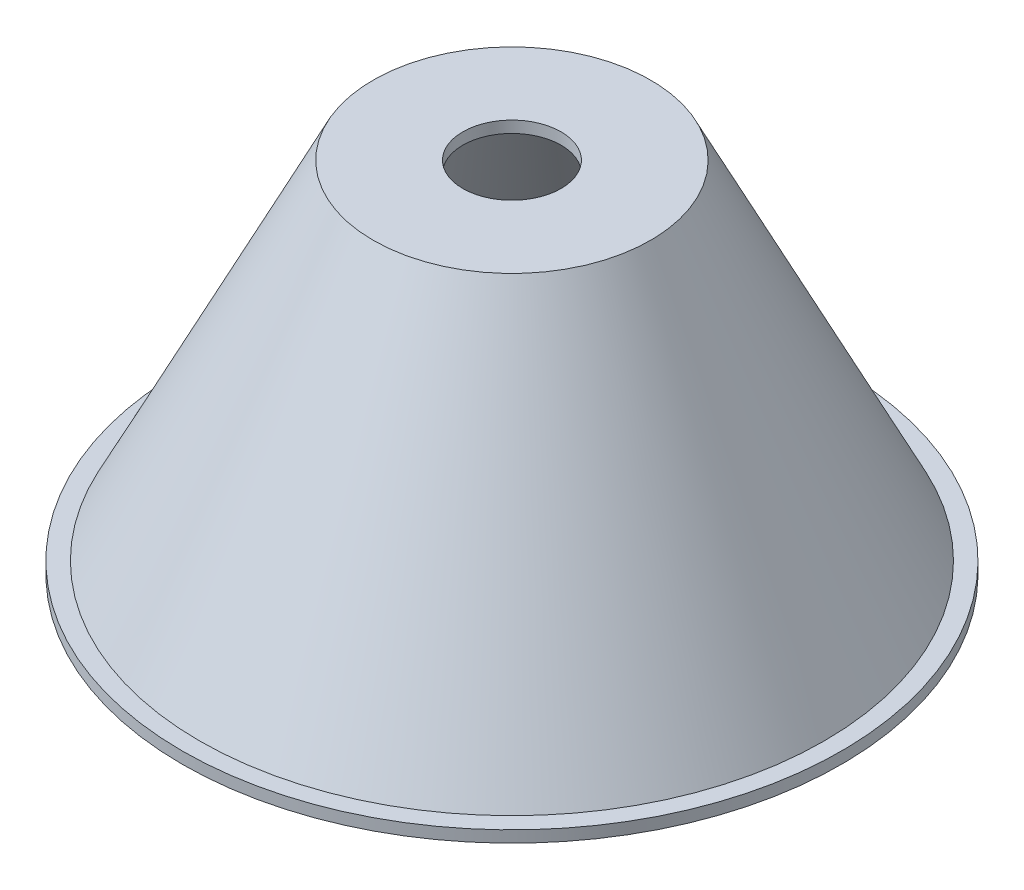
ISO-10303-21;
HEADER;
FILE_DESCRIPTION(('STEP AP214'),'2;1');
FILE_NAME('part.step','',(''),(''),'','','');
FILE_SCHEMA(('AUTOMOTIVE_DESIGN { 1 0 10303 214 1 1 1 1 }'));
ENDSEC;
DATA;
#1=APPLICATION_CONTEXT('core data for automotive mechanical design processes');
#2=APPLICATION_PROTOCOL_DEFINITION('international standard','automotive_design',2000,#1);
#3=PRODUCT_CONTEXT('',#1,'mechanical');
#4=PRODUCT('Part','Part','',(#3));
#5=PRODUCT_RELATED_PRODUCT_CATEGORY('part','',(#4));
#6=PRODUCT_DEFINITION_FORMATION('','',#4);
#7=PRODUCT_DEFINITION_CONTEXT('part definition',#1,'design');
#8=PRODUCT_DEFINITION('design','',#6,#7);
#9=PRODUCT_DEFINITION_SHAPE('','',#8);
#10=(LENGTH_UNIT() NAMED_UNIT(*) SI_UNIT(.MILLI.,.METRE.));
#11=(NAMED_UNIT(*) PLANE_ANGLE_UNIT() SI_UNIT($,.RADIAN.));
#12=(NAMED_UNIT(*) SI_UNIT($,.STERADIAN.) SOLID_ANGLE_UNIT());
#13=UNCERTAINTY_MEASURE_WITH_UNIT(LENGTH_MEASURE(1.E-05),#10,'distance_accuracy_value','');
#14=(GEOMETRIC_REPRESENTATION_CONTEXT(3) GLOBAL_UNCERTAINTY_ASSIGNED_CONTEXT((#13)) GLOBAL_UNIT_ASSIGNED_CONTEXT((#10,
#11,#12)) REPRESENTATION_CONTEXT('',''));
#15=CARTESIAN_POINT('',(0.,0.,0.));
#16=DIRECTION('',(0.,0.,1.));
#17=DIRECTION('',(1.,0.,0.));
#18=AXIS2_PLACEMENT_3D('',#15,#16,#17);
#19=CARTESIAN_POINT('',(0.,1.,0.));
#20=DIRECTION('',(0.,1.,0.));
#21=DIRECTION('',(0.,0.,1.));
#22=AXIS2_PLACEMENT_3D('',#19,#20,#21);
#23=PLANE('',#22);
#24=CARTESIAN_POINT('',(0.,1.,0.));
#25=DIRECTION('',(0.,1.,0.));
#26=DIRECTION('',(0.,0.,1.));
#27=AXIS2_PLACEMENT_3D('',#24,#25,#26);
#28=CIRCLE('',#27,28.5);
#29=CARTESIAN_POINT('',(0.,1.,28.5));
#30=VERTEX_POINT('',#29);
#31=EDGE_CURVE('E11',#30,#30,#28,.T.);
#32=ORIENTED_EDGE('',*,*,#31,.T.);
#33=EDGE_LOOP('',(#32));
#34=FACE_BOUND('',#33,.T.);
#35=CARTESIAN_POINT('',(0.,1.,0.));
#36=DIRECTION('',(0.,1.,0.));
#37=DIRECTION('',(0.,0.,1.));
#38=AXIS2_PLACEMENT_3D('',#35,#36,#37);
#39=CIRCLE('',#38,27.);
#40=CARTESIAN_POINT('',(0.,1.,27.));
#41=VERTEX_POINT('',#40);
#42=EDGE_CURVE('E54',#41,#41,#39,.T.);
#43=ORIENTED_EDGE('',*,*,#42,.F.);
#44=EDGE_LOOP('',(#43));
#45=FACE_BOUND('',#44,.T.);
#46=ADVANCED_FACE('F35',(#34,#45),#23,.T.);
#47=CARTESIAN_POINT('',(0.,1.,0.));
#48=DIRECTION('',(0.,-1.,0.));
#49=DIRECTION('',(0.,0.,-1.));
#50=AXIS2_PLACEMENT_3D('',#47,#48,#49);
#51=CYLINDRICAL_SURFACE('',#50,28.5);
#52=ORIENTED_EDGE('',*,*,#31,.F.);
#53=EDGE_LOOP('',(#52));
#54=FACE_BOUND('',#53,.T.);
#55=CARTESIAN_POINT('',(0.,0.,0.));
#56=DIRECTION('',(0.,1.,0.));
#57=DIRECTION('',(0.,0.,1.));
#58=AXIS2_PLACEMENT_3D('',#55,#56,#57);
#59=CIRCLE('',#58,28.5);
#60=CARTESIAN_POINT('',(0.,0.,28.5));
#61=VERTEX_POINT('',#60);
#62=EDGE_CURVE('E43',#61,#61,#59,.T.);
#63=ORIENTED_EDGE('',*,*,#62,.T.);
#64=EDGE_LOOP('',(#63));
#65=FACE_BOUND('',#64,.T.);
#66=ADVANCED_FACE('F37',(#54,#65),#51,.T.);
#67=CARTESIAN_POINT('',(0.,0.,0.));
#68=DIRECTION('',(0.,1.,0.));
#69=DIRECTION('',(0.,0.,1.));
#70=AXIS2_PLACEMENT_3D('',#67,#68,#69);
#71=PLANE('',#70);
#72=CARTESIAN_POINT('',(0.,0.,0.));
#73=DIRECTION('',(0.,-1.,0.));
#74=DIRECTION('',(0.,0.,-1.));
#75=AXIS2_PLACEMENT_3D('',#72,#73,#74);
#76=CIRCLE('',#75,25.75);
#77=CARTESIAN_POINT('',(0.,0.,-25.75));
#78=VERTEX_POINT('',#77);
#79=EDGE_CURVE('E85',#78,#78,#76,.T.);
#80=ORIENTED_EDGE('',*,*,#79,.F.);
#81=EDGE_LOOP('',(#80));
#82=FACE_BOUND('',#81,.T.);
#83=ORIENTED_EDGE('',*,*,#62,.F.);
#84=EDGE_LOOP('',(#83));
#85=FACE_BOUND('',#84,.T.);
#86=ADVANCED_FACE('F71',(#82,#85),#71,.F.);
#87=CARTESIAN_POINT('',(0.,31.,0.));
#88=DIRECTION('',(0.,1.,0.));
#89=DIRECTION('',(0.,0.,1.));
#90=AXIS2_PLACEMENT_3D('',#87,#88,#89);
#91=PLANE('',#90);
#92=CARTESIAN_POINT('',(0.,31.,0.));
#93=DIRECTION('',(0.,1.,0.));
#94=DIRECTION('',(0.,0.,1.));
#95=AXIS2_PLACEMENT_3D('',#92,#93,#94);
#96=CIRCLE('',#95,4.25);
#97=CARTESIAN_POINT('',(0.,31.,4.25));
#98=VERTEX_POINT('',#97);
#99=EDGE_CURVE('E39',#98,#98,#96,.T.);
#100=ORIENTED_EDGE('',*,*,#99,.F.);
#101=EDGE_LOOP('',(#100));
#102=FACE_BOUND('',#101,.T.);
#103=CARTESIAN_POINT('',(0.,31.,0.));
#104=DIRECTION('',(0.,1.,0.));
#105=DIRECTION('',(0.,0.,1.));
#106=AXIS2_PLACEMENT_3D('',#103,#104,#105);
#107=CIRCLE('',#106,12.);
#108=CARTESIAN_POINT('',(0.,31.,12.));
#109=VERTEX_POINT('',#108);
#110=EDGE_CURVE('E48',#109,#109,#107,.T.);
#111=ORIENTED_EDGE('',*,*,#110,.T.);
#112=EDGE_LOOP('',(#111));
#113=FACE_BOUND('',#112,.T.);
#114=ADVANCED_FACE('F60',(#102,#113),#91,.T.);
#115=CARTESIAN_POINT('',(0.,31.,0.));
#116=DIRECTION('',(0.,-1.,0.));
#117=DIRECTION('',(0.,0.,-1.));
#118=AXIS2_PLACEMENT_3D('',#115,#116,#117);
#119=CONICAL_SURFACE('',#118,12.,0.463647609000806);
#120=ORIENTED_EDGE('',*,*,#42,.T.);
#121=EDGE_LOOP('',(#120));
#122=FACE_BOUND('',#121,.T.);
#123=ORIENTED_EDGE('',*,*,#110,.F.);
#124=EDGE_LOOP('',(#123));
#125=FACE_BOUND('',#124,.T.);
#126=ADVANCED_FACE('F70',(#122,#125),#119,.T.);
#127=CARTESIAN_POINT('',(0.,0.,0.));
#128=DIRECTION('',(0.,-1.,0.));
#129=DIRECTION('',(0.,0.,-1.));
#130=AXIS2_PLACEMENT_3D('',#127,#128,#129);
#131=CONICAL_SURFACE('',#130,25.75,0.436332312998583);
#132=CARTESIAN_POINT('',(0.,30.,0.));
#133=DIRECTION('',(0.,-1.,0.));
#134=DIRECTION('',(0.,0.,-1.));
#135=AXIS2_PLACEMENT_3D('',#132,#133,#134);
#136=CIRCLE('',#135,11.76077025535);
#137=CARTESIAN_POINT('',(0.,30.,-11.76077025535));
#138=VERTEX_POINT('',#137);
#139=EDGE_CURVE('E89',#138,#138,#136,.T.);
#140=ORIENTED_EDGE('',*,*,#139,.F.);
#141=EDGE_LOOP('',(#140));
#142=FACE_BOUND('',#141,.T.);
#143=ORIENTED_EDGE('',*,*,#79,.T.);
#144=EDGE_LOOP('',(#143));
#145=FACE_BOUND('',#144,.T.);
#146=ADVANCED_FACE('F112',(#142,#145),#131,.F.);
#147=CARTESIAN_POINT('',(0.,30.,0.));
#148=DIRECTION('',(0.,-1.,0.));
#149=DIRECTION('',(0.,0.,-1.));
#150=AXIS2_PLACEMENT_3D('',#147,#148,#149);
#151=PLANE('',#150);
#152=CARTESIAN_POINT('',(0.,30.,0.));
#153=DIRECTION('',(0.,-1.,0.));
#154=DIRECTION('',(0.,0.,-1.));
#155=AXIS2_PLACEMENT_3D('',#152,#153,#154);
#156=CIRCLE('',#155,4.25);
#157=CARTESIAN_POINT('',(0.,30.,-4.25));
#158=VERTEX_POINT('',#157);
#159=EDGE_CURVE('E94',#158,#158,#156,.T.);
#160=ORIENTED_EDGE('',*,*,#159,.F.);
#161=EDGE_LOOP('',(#160));
#162=FACE_BOUND('',#161,.T.);
#163=ORIENTED_EDGE('',*,*,#139,.T.);
#164=EDGE_LOOP('',(#163));
#165=FACE_BOUND('',#164,.T.);
#166=ADVANCED_FACE('F116',(#162,#165),#151,.T.);
#167=CARTESIAN_POINT('',(0.,35.,0.));
#168=DIRECTION('',(0.,-1.,0.));
#169=DIRECTION('',(0.,0.,-1.));
#170=AXIS2_PLACEMENT_3D('',#167,#168,#169);
#171=CYLINDRICAL_SURFACE('',#170,4.25);
#172=ORIENTED_EDGE('',*,*,#99,.T.);
#173=EDGE_LOOP('',(#172));
#174=FACE_BOUND('',#173,.T.);
#175=ORIENTED_EDGE('',*,*,#159,.T.);
#176=EDGE_LOOP('',(#175));
#177=FACE_BOUND('',#176,.T.);
#178=ADVANCED_FACE('F121',(#174,#177),#171,.F.);
#179=CLOSED_SHELL('',(#46,#66,#86,#114,#126,#146,#166,#178));
#180=MANIFOLD_SOLID_BREP('B2',#179);
#181=ADVANCED_BREP_SHAPE_REPRESENTATION('',(#18,#180),#14);
#182=SHAPE_DEFINITION_REPRESENTATION(#9,#181);
ENDSEC;
END-ISO-10303-21;
